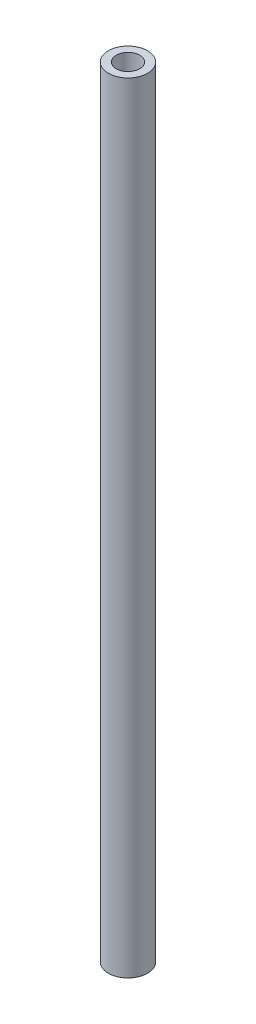
ISO-10303-21;
HEADER;
FILE_DESCRIPTION(('STEP AP214'),'2;1');
FILE_NAME('part.step','',(''),(''),'','','');
FILE_SCHEMA(('AUTOMOTIVE_DESIGN { 1 0 10303 214 1 1 1 1 }'));
ENDSEC;
DATA;
#1=APPLICATION_CONTEXT('core data for automotive mechanical design processes');
#2=APPLICATION_PROTOCOL_DEFINITION('international standard','automotive_design',2000,#1);
#3=PRODUCT_CONTEXT('',#1,'mechanical');
#4=PRODUCT('Part','Part','',(#3));
#5=PRODUCT_RELATED_PRODUCT_CATEGORY('part','',(#4));
#6=PRODUCT_DEFINITION_FORMATION('','',#4);
#7=PRODUCT_DEFINITION_CONTEXT('part definition',#1,'design');
#8=PRODUCT_DEFINITION('design','',#6,#7);
#9=PRODUCT_DEFINITION_SHAPE('','',#8);
#10=(LENGTH_UNIT() NAMED_UNIT(*) SI_UNIT(.MILLI.,.METRE.));
#11=(NAMED_UNIT(*) PLANE_ANGLE_UNIT() SI_UNIT($,.RADIAN.));
#12=(NAMED_UNIT(*) SI_UNIT($,.STERADIAN.) SOLID_ANGLE_UNIT());
#13=UNCERTAINTY_MEASURE_WITH_UNIT(LENGTH_MEASURE(1.E-05),#10,'distance_accuracy_value','');
#14=(GEOMETRIC_REPRESENTATION_CONTEXT(3) GLOBAL_UNCERTAINTY_ASSIGNED_CONTEXT((#13)) GLOBAL_UNIT_ASSIGNED_CONTEXT((#10,
#11,#12)) REPRESENTATION_CONTEXT('',''));
#15=CARTESIAN_POINT('',(0.,0.,0.));
#16=DIRECTION('',(0.,0.,1.));
#17=DIRECTION('',(1.,0.,0.));
#18=AXIS2_PLACEMENT_3D('',#15,#16,#17);
#19=CARTESIAN_POINT('',(0.,99.5,0.));
#20=DIRECTION('',(0.,1.,0.));
#21=DIRECTION('',(0.,0.,1.));
#22=AXIS2_PLACEMENT_3D('',#19,#20,#21);
#23=PLANE('',#22);
#24=CARTESIAN_POINT('',(0.,99.5,0.));
#25=DIRECTION('',(0.,1.,0.));
#26=DIRECTION('',(0.,0.,1.));
#27=AXIS2_PLACEMENT_3D('',#24,#25,#26);
#28=CIRCLE('',#27,2.5);
#29=CARTESIAN_POINT('',(0.,99.5,2.5));
#30=VERTEX_POINT('',#29);
#31=EDGE_CURVE('E10',#30,#30,#28,.T.);
#32=ORIENTED_EDGE('',*,*,#31,.T.);
#33=EDGE_LOOP('',(#32));
#34=FACE_BOUND('',#33,.T.);
#35=CARTESIAN_POINT('',(0.,99.5,0.));
#36=DIRECTION('',(0.,1.,0.));
#37=DIRECTION('',(0.,0.,1.));
#38=AXIS2_PLACEMENT_3D('',#35,#36,#37);
#39=CIRCLE('',#38,1.5);
#40=CARTESIAN_POINT('',(0.,99.5,1.5));
#41=VERTEX_POINT('',#40);
#42=EDGE_CURVE('E57',#41,#41,#39,.T.);
#43=ORIENTED_EDGE('',*,*,#42,.F.);
#44=EDGE_LOOP('',(#43));
#45=FACE_BOUND('',#44,.T.);
#46=ADVANCED_FACE('F43',(#34,#45),#23,.T.);
#47=CARTESIAN_POINT('',(0.,0.,0.));
#48=DIRECTION('',(0.,1.,0.));
#49=DIRECTION('',(0.,0.,1.));
#50=AXIS2_PLACEMENT_3D('',#47,#48,#49);
#51=PLANE('',#50);
#52=CARTESIAN_POINT('',(0.,0.,0.));
#53=DIRECTION('',(0.,1.,0.));
#54=DIRECTION('',(0.,0.,1.));
#55=AXIS2_PLACEMENT_3D('',#52,#53,#54);
#56=CIRCLE('',#55,2.5);
#57=CARTESIAN_POINT('',(0.,0.,2.5));
#58=VERTEX_POINT('',#57);
#59=EDGE_CURVE('E50',#58,#58,#56,.T.);
#60=ORIENTED_EDGE('',*,*,#59,.F.);
#61=EDGE_LOOP('',(#60));
#62=FACE_BOUND('',#61,.T.);
#63=CARTESIAN_POINT('',(0.,0.,0.));
#64=DIRECTION('',(0.,1.,0.));
#65=DIRECTION('',(0.,0.,1.));
#66=AXIS2_PLACEMENT_3D('',#63,#64,#65);
#67=CIRCLE('',#66,1.5);
#68=CARTESIAN_POINT('',(0.,0.,1.5));
#69=VERTEX_POINT('',#68);
#70=EDGE_CURVE('E59',#69,#69,#67,.T.);
#71=ORIENTED_EDGE('',*,*,#70,.T.);
#72=EDGE_LOOP('',(#71));
#73=FACE_BOUND('',#72,.T.);
#74=ADVANCED_FACE('F68',(#62,#73),#51,.F.);
#75=CARTESIAN_POINT('',(0.,99.5,0.));
#76=DIRECTION('',(0.,-1.,0.));
#77=DIRECTION('',(0.,0.,-1.));
#78=AXIS2_PLACEMENT_3D('',#75,#76,#77);
#79=CYLINDRICAL_SURFACE('',#78,2.5);
#80=ORIENTED_EDGE('',*,*,#31,.F.);
#81=EDGE_LOOP('',(#80));
#82=FACE_BOUND('',#81,.T.);
#83=ORIENTED_EDGE('',*,*,#59,.T.);
#84=EDGE_LOOP('',(#83));
#85=FACE_BOUND('',#84,.T.);
#86=ADVANCED_FACE('F44',(#82,#85),#79,.T.);
#87=CARTESIAN_POINT('',(0.,99.5,0.));
#88=DIRECTION('',(0.,-1.,0.));
#89=DIRECTION('',(0.,0.,-1.));
#90=AXIS2_PLACEMENT_3D('',#87,#88,#89);
#91=CYLINDRICAL_SURFACE('',#90,1.5);
#92=ORIENTED_EDGE('',*,*,#42,.T.);
#93=EDGE_LOOP('',(#92));
#94=FACE_BOUND('',#93,.T.);
#95=ORIENTED_EDGE('',*,*,#70,.F.);
#96=EDGE_LOOP('',(#95));
#97=FACE_BOUND('',#96,.T.);
#98=ADVANCED_FACE('F67',(#94,#97),#91,.F.);
#99=CLOSED_SHELL('',(#46,#74,#86,#98));
#100=MANIFOLD_SOLID_BREP('B2',#99);
#101=ADVANCED_BREP_SHAPE_REPRESENTATION('',(#18,#100),#14);
#102=SHAPE_DEFINITION_REPRESENTATION(#9,#101);
ENDSEC;
END-ISO-10303-21;
